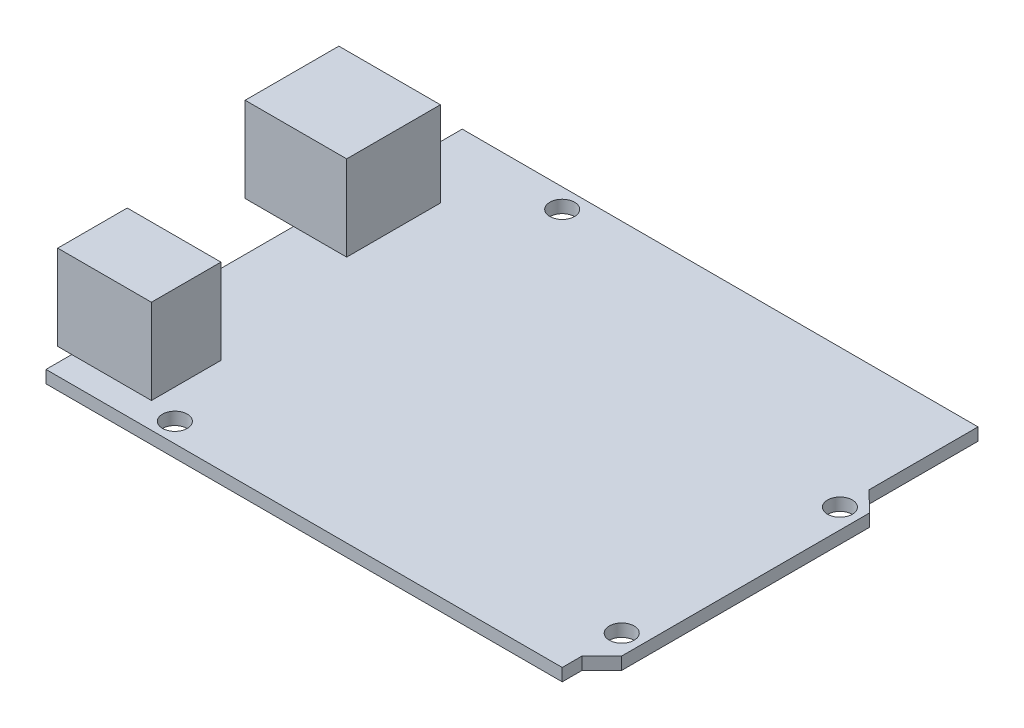
ISO-10303-21;
HEADER;
FILE_DESCRIPTION(('STEP AP214'),'2;1');
FILE_NAME('part.step','',(''),(''),'','','');
FILE_SCHEMA(('AUTOMOTIVE_DESIGN { 1 0 10303 214 1 1 1 1 }'));
ENDSEC;
DATA;
#1=APPLICATION_CONTEXT('core data for automotive mechanical design processes');
#2=APPLICATION_PROTOCOL_DEFINITION('international standard','automotive_design',2000,#1);
#3=PRODUCT_CONTEXT('',#1,'mechanical');
#4=PRODUCT('Part','Part','',(#3));
#5=PRODUCT_RELATED_PRODUCT_CATEGORY('part','',(#4));
#6=PRODUCT_DEFINITION_FORMATION('','',#4);
#7=PRODUCT_DEFINITION_CONTEXT('part definition',#1,'design');
#8=PRODUCT_DEFINITION('design','',#6,#7);
#9=PRODUCT_DEFINITION_SHAPE('','',#8);
#10=(LENGTH_UNIT() NAMED_UNIT(*) SI_UNIT(.MILLI.,.METRE.));
#11=(NAMED_UNIT(*) PLANE_ANGLE_UNIT() SI_UNIT($,.RADIAN.));
#12=(NAMED_UNIT(*) SI_UNIT($,.STERADIAN.) SOLID_ANGLE_UNIT());
#13=UNCERTAINTY_MEASURE_WITH_UNIT(LENGTH_MEASURE(1.E-05),#10,'distance_accuracy_value','');
#14=(GEOMETRIC_REPRESENTATION_CONTEXT(3) GLOBAL_UNCERTAINTY_ASSIGNED_CONTEXT((#13)) GLOBAL_UNIT_ASSIGNED_CONTEXT((#10,
#11,#12)) REPRESENTATION_CONTEXT('',''));
#15=CARTESIAN_POINT('',(0.,0.,0.));
#16=DIRECTION('',(0.,0.,1.));
#17=DIRECTION('',(1.,0.,0.));
#18=AXIS2_PLACEMENT_3D('',#15,#16,#17);
#19=CARTESIAN_POINT('',(0.,1.6,0.));
#20=DIRECTION('',(0.,1.,0.));
#21=DIRECTION('',(0.,0.,1.));
#22=AXIS2_PLACEMENT_3D('',#19,#20,#21);
#23=PLANE('',#22);
#24=CARTESIAN_POINT('',(31.8,1.6,19.03));
#25=DIRECTION('',(0.,1.,0.));
#26=DIRECTION('',(0.,0.,1.));
#27=AXIS2_PLACEMENT_3D('',#24,#25,#26);
#28=CIRCLE('',#27,1.5875);
#29=CARTESIAN_POINT('',(31.8,1.6,20.6175));
#30=VERTEX_POINT('',#29);
#31=EDGE_CURVE('E223',#30,#30,#28,.T.);
#32=ORIENTED_EDGE('',*,*,#31,.F.);
#33=EDGE_LOOP('',(#32));
#34=FACE_BOUND('',#33,.T.);
#35=CARTESIAN_POINT('',(-20.3,1.6,24.15));
#36=DIRECTION('',(0.,1.,0.));
#37=DIRECTION('',(0.,0.,1.));
#38=AXIS2_PLACEMENT_3D('',#35,#36,#37);
#39=CIRCLE('',#38,1.5875);
#40=CARTESIAN_POINT('',(-20.3,1.6,25.7375));
#41=VERTEX_POINT('',#40);
#42=EDGE_CURVE('E235',#41,#41,#39,.T.);
#43=ORIENTED_EDGE('',*,*,#42,.F.);
#44=EDGE_LOOP('',(#43));
#45=FACE_BOUND('',#44,.T.);
#46=CARTESIAN_POINT('',(-19.,1.6,-24.15));
#47=DIRECTION('',(0.,1.,0.));
#48=DIRECTION('',(0.,0.,1.));
#49=AXIS2_PLACEMENT_3D('',#46,#47,#48);
#50=CIRCLE('',#49,1.5875);
#51=CARTESIAN_POINT('',(-19.,1.6,-22.5625));
#52=VERTEX_POINT('',#51);
#53=EDGE_CURVE('E241',#52,#52,#50,.T.);
#54=ORIENTED_EDGE('',*,*,#53,.F.);
#55=EDGE_LOOP('',(#54));
#56=FACE_BOUND('',#55,.T.);
#57=CARTESIAN_POINT('',(31.8,1.6,-8.91));
#58=DIRECTION('',(0.,1.,0.));
#59=DIRECTION('',(0.,0.,1.));
#60=AXIS2_PLACEMENT_3D('',#57,#58,#59);
#61=CIRCLE('',#60,1.5875);
#62=CARTESIAN_POINT('',(31.8,1.6,-7.3225));
#63=VERTEX_POINT('',#62);
#64=EDGE_CURVE('E229',#63,#63,#61,.T.);
#65=ORIENTED_EDGE('',*,*,#64,.F.);
#66=EDGE_LOOP('',(#65));
#67=FACE_BOUND('',#66,.T.);
#68=DIRECTION('',(0.,0.,-1.));
#69=VECTOR('',#68,1.);
#70=CARTESIAN_POINT('',(-27.5,1.6,-17.05));
#71=LINE('',#70,#69);
#72=CARTESIAN_POINT('',(-27.5,1.6,-5.05));
#73=VERTEX_POINT('',#72);
#74=CARTESIAN_POINT('',(-27.5,1.6,-17.05));
#75=VERTEX_POINT('',#74);
#76=EDGE_CURVE('E50',#73,#75,#71,.T.);
#77=ORIENTED_EDGE('',*,*,#76,.F.);
#78=DIRECTION('',(1.,0.,0.));
#79=VECTOR('',#78,1.);
#80=CARTESIAN_POINT('',(-40.5,1.6,-5.05));
#81=LINE('',#80,#79);
#82=CARTESIAN_POINT('',(-34.3,1.6,-5.05));
#83=VERTEX_POINT('',#82);
#84=EDGE_CURVE('E595',#83,#73,#81,.T.);
#85=ORIENTED_EDGE('',*,*,#84,.F.);
#86=DIRECTION('',(0.,0.,1.));
#87=VECTOR('',#86,1.);
#88=CARTESIAN_POINT('',(-34.3,1.6,26.65));
#89=LINE('',#88,#87);
#90=CARTESIAN_POINT('',(-34.3,1.6,14.45));
#91=VERTEX_POINT('',#90);
#92=EDGE_CURVE('E268',#83,#91,#89,.T.);
#93=ORIENTED_EDGE('',*,*,#92,.T.);
#94=DIRECTION('',(-1.,0.,0.));
#95=VECTOR('',#94,1.);
#96=CARTESIAN_POINT('',(-36.1,1.6,14.45));
#97=LINE('',#96,#95);
#98=CARTESIAN_POINT('',(-24.1,1.6,14.45));
#99=VERTEX_POINT('',#98);
#100=EDGE_CURVE('E197',#99,#91,#97,.T.);
#101=ORIENTED_EDGE('',*,*,#100,.F.);
#102=DIRECTION('',(0.,0.,-1.));
#103=VECTOR('',#102,1.);
#104=CARTESIAN_POINT('',(-24.1,1.6,23.35));
#105=LINE('',#104,#103);
#106=CARTESIAN_POINT('',(-24.1,1.6,23.35));
#107=VERTEX_POINT('',#106);
#108=EDGE_CURVE('E205',#107,#99,#105,.T.);
#109=ORIENTED_EDGE('',*,*,#108,.F.);
#110=DIRECTION('',(1.,0.,0.));
#111=VECTOR('',#110,1.);
#112=CARTESIAN_POINT('',(-36.1,1.6,23.35));
#113=LINE('',#112,#111);
#114=CARTESIAN_POINT('',(-34.3,1.6,23.35));
#115=VERTEX_POINT('',#114);
#116=EDGE_CURVE('E11',#115,#107,#113,.T.);
#117=ORIENTED_EDGE('',*,*,#116,.F.);
#118=CARTESIAN_POINT('',(-34.3,1.6,26.65));
#119=VERTEX_POINT('',#118);
#120=EDGE_CURVE('E263',#115,#119,#89,.T.);
#121=ORIENTED_EDGE('',*,*,#120,.T.);
#122=DIRECTION('',(1.,0.,0.));
#123=VECTOR('',#122,1.);
#124=CARTESIAN_POINT('',(-34.3,1.6,26.65));
#125=LINE('',#124,#123);
#126=CARTESIAN_POINT('',(31.8,1.6,26.65));
#127=VERTEX_POINT('',#126);
#128=EDGE_CURVE('E247',#119,#127,#125,.T.);
#129=ORIENTED_EDGE('',*,*,#128,.T.);
#130=DIRECTION('',(0.,0.,-1.));
#131=VECTOR('',#130,1.);
#132=CARTESIAN_POINT('',(31.8,1.6,26.65));
#133=LINE('',#132,#131);
#134=CARTESIAN_POINT('',(31.8,1.6,24.11));
#135=VERTEX_POINT('',#134);
#136=EDGE_CURVE('E250',#127,#135,#133,.T.);
#137=ORIENTED_EDGE('',*,*,#136,.T.);
#138=DIRECTION('',(0.707106781186548,0.,-0.707106781186548));
#139=VECTOR('',#138,1.);
#140=CARTESIAN_POINT('',(31.8,1.6,24.11));
#141=LINE('',#140,#139);
#142=CARTESIAN_POINT('',(34.34,1.6,21.57));
#143=VERTEX_POINT('',#142);
#144=EDGE_CURVE('E253',#135,#143,#141,.T.);
#145=ORIENTED_EDGE('',*,*,#144,.T.);
#146=DIRECTION('',(0.,0.,-1.));
#147=VECTOR('',#146,1.);
#148=CARTESIAN_POINT('',(34.34,1.6,21.57));
#149=LINE('',#148,#147);
#150=CARTESIAN_POINT('',(34.34,1.6,-10.18));
#151=VERTEX_POINT('',#150);
#152=EDGE_CURVE('E255',#143,#151,#149,.T.);
#153=ORIENTED_EDGE('',*,*,#152,.T.);
#154=DIRECTION('',(-0.720833064901855,0.,-0.693108716251786));
#155=VECTOR('',#154,1.);
#156=CARTESIAN_POINT('',(31.74,1.6,-12.68));
#157=LINE('',#156,#155);
#158=CARTESIAN_POINT('',(31.74,1.6,-12.68));
#159=VERTEX_POINT('',#158);
#160=EDGE_CURVE('E257',#151,#159,#157,.T.);
#161=ORIENTED_EDGE('',*,*,#160,.T.);
#162=DIRECTION('',(0.,0.,-1.));
#163=VECTOR('',#162,1.);
#164=CARTESIAN_POINT('',(31.74,1.6,-26.65));
#165=LINE('',#164,#163);
#166=CARTESIAN_POINT('',(31.74,1.6,-26.65));
#167=VERTEX_POINT('',#166);
#168=EDGE_CURVE('E259',#159,#167,#165,.T.);
#169=ORIENTED_EDGE('',*,*,#168,.T.);
#170=DIRECTION('',(-1.,0.,0.));
#171=VECTOR('',#170,1.);
#172=CARTESIAN_POINT('',(-34.3,1.6,-26.65));
#173=LINE('',#172,#171);
#174=CARTESIAN_POINT('',(-34.3,1.6,-26.65));
#175=VERTEX_POINT('',#174);
#176=EDGE_CURVE('E261',#167,#175,#173,.T.);
#177=ORIENTED_EDGE('',*,*,#176,.T.);
#178=CARTESIAN_POINT('',(-34.3,1.6,-17.05));
#179=VERTEX_POINT('',#178);
#180=EDGE_CURVE('E264',#175,#179,#89,.T.);
#181=ORIENTED_EDGE('',*,*,#180,.T.);
#182=DIRECTION('',(-1.,0.,0.));
#183=VECTOR('',#182,1.);
#184=CARTESIAN_POINT('',(-40.5,1.6,-17.05));
#185=LINE('',#184,#183);
#186=EDGE_CURVE('E55',#75,#179,#185,.T.);
#187=ORIENTED_EDGE('',*,*,#186,.F.);
#188=EDGE_LOOP('',(#77,#85,#93,#101,#109,#117,#121,#129,#137,#145,#153,#161,#169,#177,#181,#187));
#189=FACE_BOUND('',#188,.T.);
#190=ADVANCED_FACE('F33',(#34,#45,#56,#67,#189),#23,.T.);
#191=CARTESIAN_POINT('',(0.,0.,0.));
#192=DIRECTION('',(0.,1.,0.));
#193=DIRECTION('',(0.,0.,1.));
#194=AXIS2_PLACEMENT_3D('',#191,#192,#193);
#195=PLANE('',#194);
#196=CARTESIAN_POINT('',(31.8,0.,-8.91));
#197=DIRECTION('',(0.,1.,0.));
#198=DIRECTION('',(0.,0.,1.));
#199=AXIS2_PLACEMENT_3D('',#196,#197,#198);
#200=CIRCLE('',#199,1.5875);
#201=CARTESIAN_POINT('',(31.8,0.,-7.3225));
#202=VERTEX_POINT('',#201);
#203=EDGE_CURVE('E226',#202,#202,#200,.T.);
#204=ORIENTED_EDGE('',*,*,#203,.T.);
#205=EDGE_LOOP('',(#204));
#206=FACE_BOUND('',#205,.T.);
#207=CARTESIAN_POINT('',(-19.,0.,-24.15));
#208=DIRECTION('',(0.,1.,0.));
#209=DIRECTION('',(0.,0.,1.));
#210=AXIS2_PLACEMENT_3D('',#207,#208,#209);
#211=CIRCLE('',#210,1.5875);
#212=CARTESIAN_POINT('',(-19.,0.,-22.5625));
#213=VERTEX_POINT('',#212);
#214=EDGE_CURVE('E238',#213,#213,#211,.T.);
#215=ORIENTED_EDGE('',*,*,#214,.T.);
#216=EDGE_LOOP('',(#215));
#217=FACE_BOUND('',#216,.T.);
#218=DIRECTION('',(1.,0.,0.));
#219=VECTOR('',#218,1.);
#220=CARTESIAN_POINT('',(-34.3,0.,26.65));
#221=LINE('',#220,#219);
#222=CARTESIAN_POINT('',(-34.3,0.,26.65));
#223=VERTEX_POINT('',#222);
#224=CARTESIAN_POINT('',(31.8,0.,26.65));
#225=VERTEX_POINT('',#224);
#226=EDGE_CURVE('E244',#223,#225,#221,.T.);
#227=ORIENTED_EDGE('',*,*,#226,.F.);
#228=DIRECTION('',(0.,0.,1.));
#229=VECTOR('',#228,1.);
#230=CARTESIAN_POINT('',(-34.3,0.,26.65));
#231=LINE('',#230,#229);
#232=CARTESIAN_POINT('',(-34.3,0.,-26.65));
#233=VERTEX_POINT('',#232);
#234=EDGE_CURVE('E251',#233,#223,#231,.T.);
#235=ORIENTED_EDGE('',*,*,#234,.F.);
#236=DIRECTION('',(-1.,0.,0.));
#237=VECTOR('',#236,1.);
#238=CARTESIAN_POINT('',(-34.3,0.,-26.65));
#239=LINE('',#238,#237);
#240=CARTESIAN_POINT('',(31.74,0.,-26.65));
#241=VERTEX_POINT('',#240);
#242=EDGE_CURVE('E282',#241,#233,#239,.T.);
#243=ORIENTED_EDGE('',*,*,#242,.F.);
#244=DIRECTION('',(0.,0.,-1.));
#245=VECTOR('',#244,1.);
#246=CARTESIAN_POINT('',(31.74,0.,-26.65));
#247=LINE('',#246,#245);
#248=CARTESIAN_POINT('',(31.74,0.,-12.68));
#249=VERTEX_POINT('',#248);
#250=EDGE_CURVE('E280',#249,#241,#247,.T.);
#251=ORIENTED_EDGE('',*,*,#250,.F.);
#252=DIRECTION('',(-0.720833064901855,0.,-0.693108716251786));
#253=VECTOR('',#252,1.);
#254=CARTESIAN_POINT('',(31.74,0.,-12.68));
#255=LINE('',#254,#253);
#256=CARTESIAN_POINT('',(34.34,0.,-10.18));
#257=VERTEX_POINT('',#256);
#258=EDGE_CURVE('E278',#257,#249,#255,.T.);
#259=ORIENTED_EDGE('',*,*,#258,.F.);
#260=DIRECTION('',(0.,0.,-1.));
#261=VECTOR('',#260,1.);
#262=CARTESIAN_POINT('',(34.34,0.,21.57));
#263=LINE('',#262,#261);
#264=CARTESIAN_POINT('',(34.34,0.,21.57));
#265=VERTEX_POINT('',#264);
#266=EDGE_CURVE('E276',#265,#257,#263,.T.);
#267=ORIENTED_EDGE('',*,*,#266,.F.);
#268=DIRECTION('',(0.707106781186548,0.,-0.707106781186548));
#269=VECTOR('',#268,1.);
#270=CARTESIAN_POINT('',(31.8,0.,24.11));
#271=LINE('',#270,#269);
#272=CARTESIAN_POINT('',(31.8,0.,24.11));
#273=VERTEX_POINT('',#272);
#274=EDGE_CURVE('E274',#273,#265,#271,.T.);
#275=ORIENTED_EDGE('',*,*,#274,.F.);
#276=DIRECTION('',(0.,0.,-1.));
#277=VECTOR('',#276,1.);
#278=CARTESIAN_POINT('',(31.8,0.,26.65));
#279=LINE('',#278,#277);
#280=EDGE_CURVE('E272',#225,#273,#279,.T.);
#281=ORIENTED_EDGE('',*,*,#280,.F.);
#282=EDGE_LOOP('',(#227,#235,#243,#251,#259,#267,#275,#281));
#283=FACE_BOUND('',#282,.T.);
#284=CARTESIAN_POINT('',(-20.3,0.,24.15));
#285=DIRECTION('',(0.,1.,0.));
#286=DIRECTION('',(0.,0.,1.));
#287=AXIS2_PLACEMENT_3D('',#284,#285,#286);
#288=CIRCLE('',#287,1.5875);
#289=CARTESIAN_POINT('',(-20.3,0.,25.7375));
#290=VERTEX_POINT('',#289);
#291=EDGE_CURVE('E232',#290,#290,#288,.T.);
#292=ORIENTED_EDGE('',*,*,#291,.T.);
#293=EDGE_LOOP('',(#292));
#294=FACE_BOUND('',#293,.T.);
#295=CARTESIAN_POINT('',(31.8,0.,19.03));
#296=DIRECTION('',(0.,1.,0.));
#297=DIRECTION('',(0.,0.,1.));
#298=AXIS2_PLACEMENT_3D('',#295,#296,#297);
#299=CIRCLE('',#298,1.5875);
#300=CARTESIAN_POINT('',(31.8,0.,20.6175));
#301=VERTEX_POINT('',#300);
#302=EDGE_CURVE('E222',#301,#301,#299,.T.);
#303=ORIENTED_EDGE('',*,*,#302,.T.);
#304=EDGE_LOOP('',(#303));
#305=FACE_BOUND('',#304,.T.);
#306=ADVANCED_FACE('F317',(#206,#217,#283,#294,#305),#195,.F.);
#307=CARTESIAN_POINT('',(-34.3,1.6,26.65));
#308=DIRECTION('',(0.,0.,-1.));
#309=DIRECTION('',(-1.,0.,0.));
#310=AXIS2_PLACEMENT_3D('',#307,#308,#309);
#311=PLANE('',#310);
#312=ORIENTED_EDGE('',*,*,#226,.T.);
#313=DIRECTION('',(0.,-1.,0.));
#314=VECTOR('',#313,1.);
#315=CARTESIAN_POINT('',(31.8,1.6,26.65));
#316=LINE('',#315,#314);
#317=EDGE_CURVE('E37',#127,#225,#316,.T.);
#318=ORIENTED_EDGE('',*,*,#317,.F.);
#319=ORIENTED_EDGE('',*,*,#128,.F.);
#320=DIRECTION('',(0.,-1.,0.));
#321=VECTOR('',#320,1.);
#322=CARTESIAN_POINT('',(-34.3,1.6,26.65));
#323=LINE('',#322,#321);
#324=EDGE_CURVE('E266',#119,#223,#323,.T.);
#325=ORIENTED_EDGE('',*,*,#324,.T.);
#326=EDGE_LOOP('',(#312,#318,#319,#325));
#327=FACE_BOUND('',#326,.T.);
#328=ADVANCED_FACE('F35',(#327),#311,.F.);
#329=CARTESIAN_POINT('',(31.8,1.6,26.65));
#330=DIRECTION('',(-1.,0.,0.));
#331=DIRECTION('',(0.,0.,1.));
#332=AXIS2_PLACEMENT_3D('',#329,#330,#331);
#333=PLANE('',#332);
#334=ORIENTED_EDGE('',*,*,#280,.T.);
#335=DIRECTION('',(0.,-1.,0.));
#336=VECTOR('',#335,1.);
#337=CARTESIAN_POINT('',(31.8,1.6,24.11));
#338=LINE('',#337,#336);
#339=EDGE_CURVE('E301',#135,#273,#338,.T.);
#340=ORIENTED_EDGE('',*,*,#339,.F.);
#341=ORIENTED_EDGE('',*,*,#136,.F.);
#342=ORIENTED_EDGE('',*,*,#317,.T.);
#343=EDGE_LOOP('',(#334,#340,#341,#342));
#344=FACE_BOUND('',#343,.T.);
#345=ADVANCED_FACE('F310',(#344),#333,.F.);
#346=CARTESIAN_POINT('',(31.8,1.6,24.11));
#347=DIRECTION('',(-0.707106781186548,0.,-0.707106781186548));
#348=DIRECTION('',(-0.707106781186548,0.,0.707106781186548));
#349=AXIS2_PLACEMENT_3D('',#346,#347,#348);
#350=PLANE('',#349);
#351=ORIENTED_EDGE('',*,*,#274,.T.);
#352=DIRECTION('',(0.,-1.,0.));
#353=VECTOR('',#352,1.);
#354=CARTESIAN_POINT('',(34.34,1.6,21.57));
#355=LINE('',#354,#353);
#356=EDGE_CURVE('E299',#143,#265,#355,.T.);
#357=ORIENTED_EDGE('',*,*,#356,.F.);
#358=ORIENTED_EDGE('',*,*,#144,.F.);
#359=ORIENTED_EDGE('',*,*,#339,.T.);
#360=EDGE_LOOP('',(#351,#357,#358,#359));
#361=FACE_BOUND('',#360,.T.);
#362=ADVANCED_FACE('F323',(#361),#350,.F.);
#363=CARTESIAN_POINT('',(34.34,1.6,21.57));
#364=DIRECTION('',(-1.,0.,0.));
#365=DIRECTION('',(0.,0.,1.));
#366=AXIS2_PLACEMENT_3D('',#363,#364,#365);
#367=PLANE('',#366);
#368=ORIENTED_EDGE('',*,*,#266,.T.);
#369=DIRECTION('',(0.,-1.,0.));
#370=VECTOR('',#369,1.);
#371=CARTESIAN_POINT('',(34.34,1.6,-10.18));
#372=LINE('',#371,#370);
#373=EDGE_CURVE('E296',#151,#257,#372,.T.);
#374=ORIENTED_EDGE('',*,*,#373,.F.);
#375=ORIENTED_EDGE('',*,*,#152,.F.);
#376=ORIENTED_EDGE('',*,*,#356,.T.);
#377=EDGE_LOOP('',(#368,#374,#375,#376));
#378=FACE_BOUND('',#377,.T.);
#379=ADVANCED_FACE('F326',(#378),#367,.F.);
#380=CARTESIAN_POINT('',(31.74,1.6,-12.68));
#381=DIRECTION('',(-0.693108716251786,0.,0.720833064901855));
#382=DIRECTION('',(0.720833064901855,0.,0.693108716251786));
#383=AXIS2_PLACEMENT_3D('',#380,#381,#382);
#384=PLANE('',#383);
#385=ORIENTED_EDGE('',*,*,#258,.T.);
#386=DIRECTION('',(0.,-1.,0.));
#387=VECTOR('',#386,1.);
#388=CARTESIAN_POINT('',(31.74,1.6,-12.68));
#389=LINE('',#388,#387);
#390=EDGE_CURVE('E293',#159,#249,#389,.T.);
#391=ORIENTED_EDGE('',*,*,#390,.F.);
#392=ORIENTED_EDGE('',*,*,#160,.F.);
#393=ORIENTED_EDGE('',*,*,#373,.T.);
#394=EDGE_LOOP('',(#385,#391,#392,#393));
#395=FACE_BOUND('',#394,.T.);
#396=ADVANCED_FACE('F346',(#395),#384,.F.);
#397=CARTESIAN_POINT('',(31.74,1.6,-26.65));
#398=DIRECTION('',(-1.,0.,0.));
#399=DIRECTION('',(0.,0.,1.));
#400=AXIS2_PLACEMENT_3D('',#397,#398,#399);
#401=PLANE('',#400);
#402=ORIENTED_EDGE('',*,*,#250,.T.);
#403=DIRECTION('',(0.,-1.,0.));
#404=VECTOR('',#403,1.);
#405=CARTESIAN_POINT('',(31.74,1.6,-26.65));
#406=LINE('',#405,#404);
#407=EDGE_CURVE('E290',#167,#241,#406,.T.);
#408=ORIENTED_EDGE('',*,*,#407,.F.);
#409=ORIENTED_EDGE('',*,*,#168,.F.);
#410=ORIENTED_EDGE('',*,*,#390,.T.);
#411=EDGE_LOOP('',(#402,#408,#409,#410));
#412=FACE_BOUND('',#411,.T.);
#413=ADVANCED_FACE('F343',(#412),#401,.F.);
#414=CARTESIAN_POINT('',(-34.3,1.6,-26.65));
#415=DIRECTION('',(0.,0.,1.));
#416=DIRECTION('',(1.,0.,0.));
#417=AXIS2_PLACEMENT_3D('',#414,#415,#416);
#418=PLANE('',#417);
#419=ORIENTED_EDGE('',*,*,#242,.T.);
#420=DIRECTION('',(0.,-1.,0.));
#421=VECTOR('',#420,1.);
#422=CARTESIAN_POINT('',(-34.3,1.6,-26.65));
#423=LINE('',#422,#421);
#424=EDGE_CURVE('E287',#175,#233,#423,.T.);
#425=ORIENTED_EDGE('',*,*,#424,.F.);
#426=ORIENTED_EDGE('',*,*,#176,.F.);
#427=ORIENTED_EDGE('',*,*,#407,.T.);
#428=EDGE_LOOP('',(#419,#425,#426,#427));
#429=FACE_BOUND('',#428,.T.);
#430=ADVANCED_FACE('F339',(#429),#418,.F.);
#431=CARTESIAN_POINT('',(-34.3,1.6,26.65));
#432=DIRECTION('',(1.,0.,0.));
#433=DIRECTION('',(0.,0.,-1.));
#434=AXIS2_PLACEMENT_3D('',#431,#432,#433);
#435=PLANE('',#434);
#436=ORIENTED_EDGE('',*,*,#234,.T.);
#437=ORIENTED_EDGE('',*,*,#324,.F.);
#438=ORIENTED_EDGE('',*,*,#120,.F.);
#439=EDGE_CURVE('E269',#91,#115,#89,.T.);
#440=ORIENTED_EDGE('',*,*,#439,.F.);
#441=ORIENTED_EDGE('',*,*,#92,.F.);
#442=EDGE_CURVE('E267',#179,#83,#89,.T.);
#443=ORIENTED_EDGE('',*,*,#442,.F.);
#444=ORIENTED_EDGE('',*,*,#180,.F.);
#445=ORIENTED_EDGE('',*,*,#424,.T.);
#446=EDGE_LOOP('',(#436,#437,#438,#440,#441,#443,#444,#445));
#447=FACE_BOUND('',#446,.T.);
#448=ADVANCED_FACE('F334',(#447),#435,.F.);
#449=CARTESIAN_POINT('',(-19.,1.6,-24.15));
#450=DIRECTION('',(0.,-1.,0.));
#451=DIRECTION('',(0.,0.,-1.));
#452=AXIS2_PLACEMENT_3D('',#449,#450,#451);
#453=CYLINDRICAL_SURFACE('',#452,1.5875);
#454=ORIENTED_EDGE('',*,*,#53,.T.);
#455=EDGE_LOOP('',(#454));
#456=FACE_BOUND('',#455,.T.);
#457=ORIENTED_EDGE('',*,*,#214,.F.);
#458=EDGE_LOOP('',(#457));
#459=FACE_BOUND('',#458,.T.);
#460=ADVANCED_FACE('F366',(#456,#459),#453,.F.);
#461=CARTESIAN_POINT('',(-20.3,1.6,24.15));
#462=DIRECTION('',(0.,-1.,0.));
#463=DIRECTION('',(0.,0.,-1.));
#464=AXIS2_PLACEMENT_3D('',#461,#462,#463);
#465=CYLINDRICAL_SURFACE('',#464,1.5875);
#466=ORIENTED_EDGE('',*,*,#42,.T.);
#467=EDGE_LOOP('',(#466));
#468=FACE_BOUND('',#467,.T.);
#469=ORIENTED_EDGE('',*,*,#291,.F.);
#470=EDGE_LOOP('',(#469));
#471=FACE_BOUND('',#470,.T.);
#472=ADVANCED_FACE('F387',(#468,#471),#465,.F.);
#473=CARTESIAN_POINT('',(31.8,1.6,-8.91));
#474=DIRECTION('',(0.,-1.,0.));
#475=DIRECTION('',(0.,0.,-1.));
#476=AXIS2_PLACEMENT_3D('',#473,#474,#475);
#477=CYLINDRICAL_SURFACE('',#476,1.5875);
#478=ORIENTED_EDGE('',*,*,#64,.T.);
#479=EDGE_LOOP('',(#478));
#480=FACE_BOUND('',#479,.T.);
#481=ORIENTED_EDGE('',*,*,#203,.F.);
#482=EDGE_LOOP('',(#481));
#483=FACE_BOUND('',#482,.T.);
#484=ADVANCED_FACE('F394',(#480,#483),#477,.F.);
#485=CARTESIAN_POINT('',(31.8,1.6,19.03));
#486=DIRECTION('',(0.,-1.,0.));
#487=DIRECTION('',(0.,0.,-1.));
#488=AXIS2_PLACEMENT_3D('',#485,#486,#487);
#489=CYLINDRICAL_SURFACE('',#488,1.5875);
#490=ORIENTED_EDGE('',*,*,#31,.T.);
#491=EDGE_LOOP('',(#490));
#492=FACE_BOUND('',#491,.T.);
#493=ORIENTED_EDGE('',*,*,#302,.F.);
#494=EDGE_LOOP('',(#493));
#495=FACE_BOUND('',#494,.T.);
#496=ADVANCED_FACE('F401',(#492,#495),#489,.F.);
#497=CARTESIAN_POINT('',(-36.1,12.5,23.35));
#498=DIRECTION('',(1.,0.,0.));
#499=DIRECTION('',(0.,0.,-1.));
#500=AXIS2_PLACEMENT_3D('',#497,#498,#499);
#501=PLANE('',#500);
#502=DIRECTION('',(0.,0.,1.));
#503=VECTOR('',#502,1.);
#504=CARTESIAN_POINT('',(-36.1,1.6,23.35));
#505=LINE('',#504,#503);
#506=CARTESIAN_POINT('',(-36.1,1.6,14.45));
#507=VERTEX_POINT('',#506);
#508=CARTESIAN_POINT('',(-36.1,1.6,23.35));
#509=VERTEX_POINT('',#508);
#510=EDGE_CURVE('E185',#507,#509,#505,.T.);
#511=ORIENTED_EDGE('',*,*,#510,.T.);
#512=DIRECTION('',(0.,-1.,0.));
#513=VECTOR('',#512,1.);
#514=CARTESIAN_POINT('',(-36.1,12.5,23.35));
#515=LINE('',#514,#513);
#516=CARTESIAN_POINT('',(-36.1,12.5,23.35));
#517=VERTEX_POINT('',#516);
#518=EDGE_CURVE('E219',#517,#509,#515,.T.);
#519=ORIENTED_EDGE('',*,*,#518,.F.);
#520=DIRECTION('',(0.,0.,1.));
#521=VECTOR('',#520,1.);
#522=CARTESIAN_POINT('',(-36.1,12.5,23.35));
#523=LINE('',#522,#521);
#524=CARTESIAN_POINT('',(-36.1,12.5,14.45));
#525=VERTEX_POINT('',#524);
#526=EDGE_CURVE('E193',#525,#517,#523,.T.);
#527=ORIENTED_EDGE('',*,*,#526,.F.);
#528=DIRECTION('',(0.,-1.,0.));
#529=VECTOR('',#528,1.);
#530=CARTESIAN_POINT('',(-36.1,12.5,14.45));
#531=LINE('',#530,#529);
#532=EDGE_CURVE('E202',#525,#507,#531,.T.);
#533=ORIENTED_EDGE('',*,*,#532,.T.);
#534=EDGE_LOOP('',(#511,#519,#527,#533));
#535=FACE_BOUND('',#534,.T.);
#536=ADVANCED_FACE('F409',(#535),#501,.F.);
#537=CARTESIAN_POINT('',(-36.1,12.5,23.35));
#538=DIRECTION('',(0.,0.,-1.));
#539=DIRECTION('',(-1.,0.,0.));
#540=AXIS2_PLACEMENT_3D('',#537,#538,#539);
#541=PLANE('',#540);
#542=EDGE_CURVE('E43',#509,#115,#113,.T.);
#543=ORIENTED_EDGE('',*,*,#542,.T.);
#544=ORIENTED_EDGE('',*,*,#116,.T.);
#545=DIRECTION('',(0.,-1.,0.));
#546=VECTOR('',#545,1.);
#547=CARTESIAN_POINT('',(-24.1,12.5,23.35));
#548=LINE('',#547,#546);
#549=CARTESIAN_POINT('',(-24.1,12.5,23.35));
#550=VERTEX_POINT('',#549);
#551=EDGE_CURVE('E216',#550,#107,#548,.T.);
#552=ORIENTED_EDGE('',*,*,#551,.F.);
#553=DIRECTION('',(1.,0.,0.));
#554=VECTOR('',#553,1.);
#555=CARTESIAN_POINT('',(-36.1,12.5,23.35));
#556=LINE('',#555,#554);
#557=EDGE_CURVE('E196',#517,#550,#556,.T.);
#558=ORIENTED_EDGE('',*,*,#557,.F.);
#559=ORIENTED_EDGE('',*,*,#518,.T.);
#560=EDGE_LOOP('',(#543,#544,#552,#558,#559));
#561=FACE_BOUND('',#560,.T.);
#562=ADVANCED_FACE('F416',(#561),#541,.F.);
#563=CARTESIAN_POINT('',(-24.1,12.5,23.35));
#564=DIRECTION('',(-1.,0.,0.));
#565=DIRECTION('',(0.,0.,1.));
#566=AXIS2_PLACEMENT_3D('',#563,#564,#565);
#567=PLANE('',#566);
#568=ORIENTED_EDGE('',*,*,#108,.T.);
#569=DIRECTION('',(0.,-1.,0.));
#570=VECTOR('',#569,1.);
#571=CARTESIAN_POINT('',(-24.1,12.5,14.45));
#572=LINE('',#571,#570);
#573=CARTESIAN_POINT('',(-24.1,12.5,14.45));
#574=VERTEX_POINT('',#573);
#575=EDGE_CURVE('E213',#574,#99,#572,.T.);
#576=ORIENTED_EDGE('',*,*,#575,.F.);
#577=DIRECTION('',(0.,0.,-1.));
#578=VECTOR('',#577,1.);
#579=CARTESIAN_POINT('',(-24.1,12.5,23.35));
#580=LINE('',#579,#578);
#581=EDGE_CURVE('E199',#550,#574,#580,.T.);
#582=ORIENTED_EDGE('',*,*,#581,.F.);
#583=ORIENTED_EDGE('',*,*,#551,.T.);
#584=EDGE_LOOP('',(#568,#576,#582,#583));
#585=FACE_BOUND('',#584,.T.);
#586=ADVANCED_FACE('F424',(#585),#567,.F.);
#587=CARTESIAN_POINT('',(-36.1,12.5,14.45));
#588=DIRECTION('',(0.,0.,1.));
#589=DIRECTION('',(1.,0.,0.));
#590=AXIS2_PLACEMENT_3D('',#587,#588,#589);
#591=PLANE('',#590);
#592=ORIENTED_EDGE('',*,*,#100,.T.);
#593=EDGE_CURVE('E208',#91,#507,#97,.T.);
#594=ORIENTED_EDGE('',*,*,#593,.T.);
#595=ORIENTED_EDGE('',*,*,#532,.F.);
#596=DIRECTION('',(-1.,0.,0.));
#597=VECTOR('',#596,1.);
#598=CARTESIAN_POINT('',(-36.1,12.5,14.45));
#599=LINE('',#598,#597);
#600=EDGE_CURVE('E201',#574,#525,#599,.T.);
#601=ORIENTED_EDGE('',*,*,#600,.F.);
#602=ORIENTED_EDGE('',*,*,#575,.T.);
#603=EDGE_LOOP('',(#592,#594,#595,#601,#602));
#604=FACE_BOUND('',#603,.T.);
#605=ADVANCED_FACE('F432',(#604),#591,.F.);
#606=CARTESIAN_POINT('',(0.,12.5,0.));
#607=DIRECTION('',(0.,-1.,0.));
#608=DIRECTION('',(0.,0.,-1.));
#609=AXIS2_PLACEMENT_3D('',#606,#607,#608);
#610=PLANE('',#609);
#611=ORIENTED_EDGE('',*,*,#526,.T.);
#612=ORIENTED_EDGE('',*,*,#557,.T.);
#613=ORIENTED_EDGE('',*,*,#581,.T.);
#614=ORIENTED_EDGE('',*,*,#600,.T.);
#615=EDGE_LOOP('',(#611,#612,#613,#614));
#616=FACE_BOUND('',#615,.T.);
#617=ADVANCED_FACE('F440',(#616),#610,.F.);
#618=CARTESIAN_POINT('',(0.,1.6,0.));
#619=DIRECTION('',(0.,-1.,0.));
#620=DIRECTION('',(0.,0.,-1.));
#621=AXIS2_PLACEMENT_3D('',#618,#619,#620);
#622=PLANE('',#621);
#623=ORIENTED_EDGE('',*,*,#593,.F.);
#624=ORIENTED_EDGE('',*,*,#439,.T.);
#625=ORIENTED_EDGE('',*,*,#542,.F.);
#626=ORIENTED_EDGE('',*,*,#510,.F.);
#627=EDGE_LOOP('',(#623,#624,#625,#626));
#628=FACE_BOUND('',#627,.T.);
#629=ADVANCED_FACE('F448',(#628),#622,.T.);
#630=CARTESIAN_POINT('',(0.,1.6,0.));
#631=DIRECTION('',(0.,1.,0.));
#632=DIRECTION('',(0.,0.,1.));
#633=AXIS2_PLACEMENT_3D('',#630,#631,#632);
#634=PLANE('',#633);
#635=CARTESIAN_POINT('',(-40.5,1.6,-17.05));
#636=VERTEX_POINT('',#635);
#637=EDGE_CURVE('E585',#179,#636,#185,.T.);
#638=ORIENTED_EDGE('',*,*,#637,.F.);
#639=ORIENTED_EDGE('',*,*,#442,.T.);
#640=CARTESIAN_POINT('',(-40.5,1.6,-5.05));
#641=VERTEX_POINT('',#640);
#642=EDGE_CURVE('E596',#641,#83,#81,.T.);
#643=ORIENTED_EDGE('',*,*,#642,.F.);
#644=DIRECTION('',(0.,0.,1.));
#645=VECTOR('',#644,1.);
#646=CARTESIAN_POINT('',(-40.5,1.6,-17.05));
#647=LINE('',#646,#645);
#648=EDGE_CURVE('E184',#636,#641,#647,.T.);
#649=ORIENTED_EDGE('',*,*,#648,.F.);
#650=EDGE_LOOP('',(#638,#639,#643,#649));
#651=FACE_BOUND('',#650,.T.);
#652=ADVANCED_FACE('F456',(#651),#634,.F.);
#653=CARTESIAN_POINT('',(-40.5,12.5,-17.05));
#654=DIRECTION('',(1.,0.,0.));
#655=DIRECTION('',(0.,0.,-1.));
#656=AXIS2_PLACEMENT_3D('',#653,#654,#655);
#657=PLANE('',#656);
#658=ORIENTED_EDGE('',*,*,#648,.T.);
#659=DIRECTION('',(0.,-1.,0.));
#660=VECTOR('',#659,1.);
#661=CARTESIAN_POINT('',(-40.5,12.5,-5.05));
#662=LINE('',#661,#660);
#663=CARTESIAN_POINT('',(-40.5,12.5,-5.05));
#664=VERTEX_POINT('',#663);
#665=EDGE_CURVE('E165',#664,#641,#662,.T.);
#666=ORIENTED_EDGE('',*,*,#665,.F.);
#667=DIRECTION('',(0.,0.,1.));
#668=VECTOR('',#667,1.);
#669=CARTESIAN_POINT('',(-40.5,12.5,-17.05));
#670=LINE('',#669,#668);
#671=CARTESIAN_POINT('',(-40.5,12.5,-17.05));
#672=VERTEX_POINT('',#671);
#673=EDGE_CURVE('E172',#672,#664,#670,.T.);
#674=ORIENTED_EDGE('',*,*,#673,.F.);
#675=DIRECTION('',(0.,-1.,0.));
#676=VECTOR('',#675,1.);
#677=CARTESIAN_POINT('',(-40.5,12.5,-17.05));
#678=LINE('',#677,#676);
#679=EDGE_CURVE('E591',#672,#636,#678,.T.);
#680=ORIENTED_EDGE('',*,*,#679,.T.);
#681=EDGE_LOOP('',(#658,#666,#674,#680));
#682=FACE_BOUND('',#681,.T.);
#683=ADVANCED_FACE('F182',(#682),#657,.F.);
#684=CARTESIAN_POINT('',(-40.5,12.5,-5.05));
#685=DIRECTION('',(0.,0.,-1.));
#686=DIRECTION('',(-1.,0.,0.));
#687=AXIS2_PLACEMENT_3D('',#684,#685,#686);
#688=PLANE('',#687);
#689=ORIENTED_EDGE('',*,*,#642,.T.);
#690=ORIENTED_EDGE('',*,*,#84,.T.);
#691=DIRECTION('',(0.,-1.,0.));
#692=VECTOR('',#691,1.);
#693=CARTESIAN_POINT('',(-27.5,12.5,-5.05));
#694=LINE('',#693,#692);
#695=CARTESIAN_POINT('',(-27.5,12.5,-5.05));
#696=VERTEX_POINT('',#695);
#697=EDGE_CURVE('E168',#696,#73,#694,.T.);
#698=ORIENTED_EDGE('',*,*,#697,.F.);
#699=DIRECTION('',(1.,0.,0.));
#700=VECTOR('',#699,1.);
#701=CARTESIAN_POINT('',(-40.5,12.5,-5.05));
#702=LINE('',#701,#700);
#703=EDGE_CURVE('E160',#664,#696,#702,.T.);
#704=ORIENTED_EDGE('',*,*,#703,.F.);
#705=ORIENTED_EDGE('',*,*,#665,.T.);
#706=EDGE_LOOP('',(#689,#690,#698,#704,#705));
#707=FACE_BOUND('',#706,.T.);
#708=ADVANCED_FACE('F163',(#707),#688,.F.);
#709=CARTESIAN_POINT('',(-27.5,12.5,-17.05));
#710=DIRECTION('',(-1.,0.,0.));
#711=DIRECTION('',(0.,0.,1.));
#712=AXIS2_PLACEMENT_3D('',#709,#710,#711);
#713=PLANE('',#712);
#714=ORIENTED_EDGE('',*,*,#76,.T.);
#715=DIRECTION('',(0.,-1.,0.));
#716=VECTOR('',#715,1.);
#717=CARTESIAN_POINT('',(-27.5,12.5,-17.05));
#718=LINE('',#717,#716);
#719=CARTESIAN_POINT('',(-27.5,12.5,-17.05));
#720=VERTEX_POINT('',#719);
#721=EDGE_CURVE('E189',#720,#75,#718,.T.);
#722=ORIENTED_EDGE('',*,*,#721,.F.);
#723=DIRECTION('',(0.,0.,-1.));
#724=VECTOR('',#723,1.);
#725=CARTESIAN_POINT('',(-27.5,12.5,-17.05));
#726=LINE('',#725,#724);
#727=EDGE_CURVE('E171',#696,#720,#726,.T.);
#728=ORIENTED_EDGE('',*,*,#727,.F.);
#729=ORIENTED_EDGE('',*,*,#697,.T.);
#730=EDGE_LOOP('',(#714,#722,#728,#729));
#731=FACE_BOUND('',#730,.T.);
#732=ADVANCED_FACE('F477',(#731),#713,.F.);
#733=CARTESIAN_POINT('',(-40.5,12.5,-17.05));
#734=DIRECTION('',(0.,0.,1.));
#735=DIRECTION('',(1.,0.,0.));
#736=AXIS2_PLACEMENT_3D('',#733,#734,#735);
#737=PLANE('',#736);
#738=ORIENTED_EDGE('',*,*,#186,.T.);
#739=ORIENTED_EDGE('',*,*,#637,.T.);
#740=ORIENTED_EDGE('',*,*,#679,.F.);
#741=DIRECTION('',(-1.,0.,0.));
#742=VECTOR('',#741,1.);
#743=CARTESIAN_POINT('',(-40.5,12.5,-17.05));
#744=LINE('',#743,#742);
#745=EDGE_CURVE('E177',#720,#672,#744,.T.);
#746=ORIENTED_EDGE('',*,*,#745,.F.);
#747=ORIENTED_EDGE('',*,*,#721,.T.);
#748=EDGE_LOOP('',(#738,#739,#740,#746,#747));
#749=FACE_BOUND('',#748,.T.);
#750=ADVANCED_FACE('F484',(#749),#737,.F.);
#751=CARTESIAN_POINT('',(0.,12.5,0.));
#752=DIRECTION('',(0.,1.,0.));
#753=DIRECTION('',(0.,0.,1.));
#754=AXIS2_PLACEMENT_3D('',#751,#752,#753);
#755=PLANE('',#754);
#756=ORIENTED_EDGE('',*,*,#673,.T.);
#757=ORIENTED_EDGE('',*,*,#703,.T.);
#758=ORIENTED_EDGE('',*,*,#727,.T.);
#759=ORIENTED_EDGE('',*,*,#745,.T.);
#760=EDGE_LOOP('',(#756,#757,#758,#759));
#761=FACE_BOUND('',#760,.T.);
#762=ADVANCED_FACE('F175',(#761),#755,.T.);
#763=CLOSED_SHELL('',(#190,#306,#328,#345,#362,#379,#396,#413,#430,#448,#460,#472,#484,#496,
#536,#562,#586,#605,#617,#629,#652,#683,#708,#732,#750,#762));
#764=MANIFOLD_SOLID_BREP('B2',#763);
#765=ADVANCED_BREP_SHAPE_REPRESENTATION('',(#18,#764),#14);
#766=SHAPE_DEFINITION_REPRESENTATION(#9,#765);
ENDSEC;
END-ISO-10303-21;
